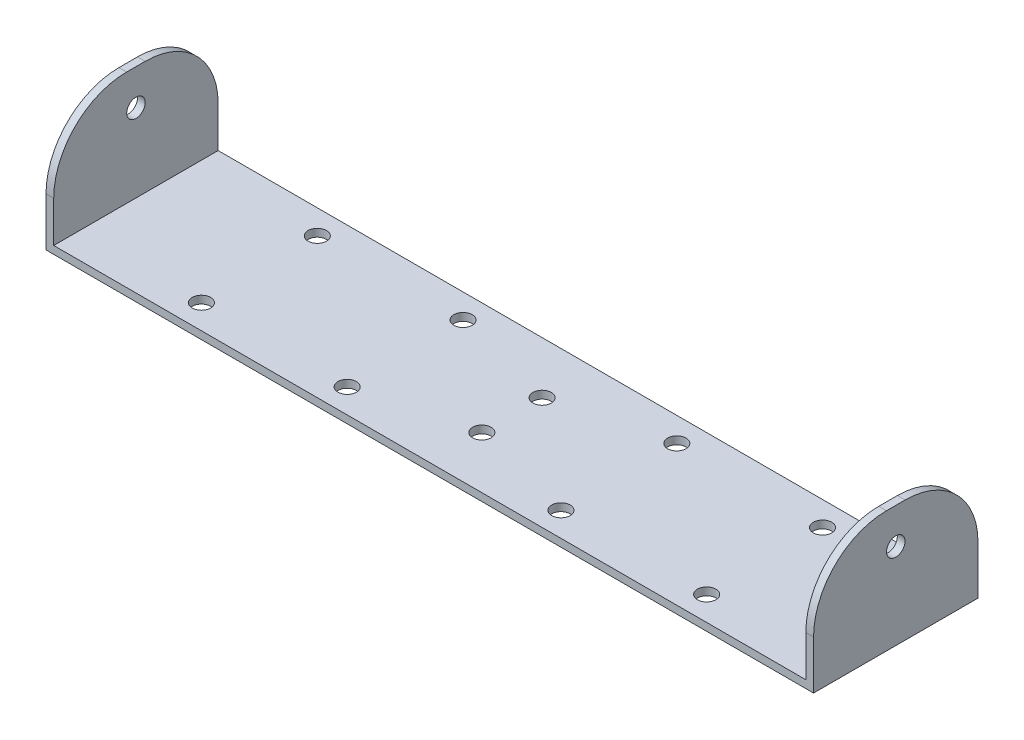
ISO-10303-21;
HEADER;
FILE_DESCRIPTION(('STEP AP214'),'2;1');
FILE_NAME('part.step','',(''),(''),'','','');
FILE_SCHEMA(('AUTOMOTIVE_DESIGN { 1 0 10303 214 1 1 1 1 }'));
ENDSEC;
DATA;
#1=APPLICATION_CONTEXT('core data for automotive mechanical design processes');
#2=APPLICATION_PROTOCOL_DEFINITION('international standard','automotive_design',2000,#1);
#3=PRODUCT_CONTEXT('',#1,'mechanical');
#4=PRODUCT('Part','Part','',(#3));
#5=PRODUCT_RELATED_PRODUCT_CATEGORY('part','',(#4));
#6=PRODUCT_DEFINITION_FORMATION('','',#4);
#7=PRODUCT_DEFINITION_CONTEXT('part definition',#1,'design');
#8=PRODUCT_DEFINITION('design','',#6,#7);
#9=PRODUCT_DEFINITION_SHAPE('','',#8);
#10=(LENGTH_UNIT() NAMED_UNIT(*) SI_UNIT(.MILLI.,.METRE.));
#11=(NAMED_UNIT(*) PLANE_ANGLE_UNIT() SI_UNIT($,.RADIAN.));
#12=(NAMED_UNIT(*) SI_UNIT($,.STERADIAN.) SOLID_ANGLE_UNIT());
#13=UNCERTAINTY_MEASURE_WITH_UNIT(LENGTH_MEASURE(1.E-05),#10,'distance_accuracy_value','');
#14=(GEOMETRIC_REPRESENTATION_CONTEXT(3) GLOBAL_UNCERTAINTY_ASSIGNED_CONTEXT((#13)) GLOBAL_UNIT_ASSIGNED_CONTEXT((#10,
#11,#12)) REPRESENTATION_CONTEXT('',''));
#15=CARTESIAN_POINT('',(0.,0.,0.));
#16=DIRECTION('',(0.,0.,1.));
#17=DIRECTION('',(1.,0.,0.));
#18=AXIS2_PLACEMENT_3D('',#15,#16,#17);
#19=CARTESIAN_POINT('',(0.,1.5875,33.85));
#20=DIRECTION('',(0.,-1.,0.));
#21=DIRECTION('',(1.,0.,0.));
#22=AXIS2_PLACEMENT_3D('',#19,#20,#21);
#23=PLANE('',#22);
#24=CARTESIAN_POINT('',(0.,1.5875,23.125));
#25=DIRECTION('',(0.,-1.,0.));
#26=DIRECTION('',(1.,0.,0.));
#27=AXIS2_PLACEMENT_3D('',#24,#25,#26);
#28=CIRCLE('',#27,1.89864999999999);
#29=CARTESIAN_POINT('',(1.89864999999999,1.5875,23.125));
#30=VERTEX_POINT('',#29);
#31=EDGE_CURVE('E387',#30,#30,#28,.T.);
#32=ORIENTED_EDGE('',*,*,#31,.T.);
#33=EDGE_LOOP('',(#32));
#34=FACE_BOUND('',#33,.T.);
#35=CARTESIAN_POINT('',(0.,1.5875,10.725));
#36=DIRECTION('',(0.,-1.,0.));
#37=DIRECTION('',(1.,0.,0.));
#38=AXIS2_PLACEMENT_3D('',#35,#36,#37);
#39=CIRCLE('',#38,1.89864999999999);
#40=CARTESIAN_POINT('',(1.89864999999999,1.5875,10.725));
#41=VERTEX_POINT('',#40);
#42=EDGE_CURVE('E391',#41,#41,#39,.T.);
#43=ORIENTED_EDGE('',*,*,#42,.T.);
#44=EDGE_LOOP('',(#43));
#45=FACE_BOUND('',#44,.T.);
#46=CARTESIAN_POINT('',(22.,1.5875,5.));
#47=DIRECTION('',(0.,-1.,0.));
#48=DIRECTION('',(1.,0.,0.));
#49=AXIS2_PLACEMENT_3D('',#46,#47,#48);
#50=CIRCLE('',#49,1.89864999999999);
#51=CARTESIAN_POINT('',(23.89865,1.5875,5.));
#52=VERTEX_POINT('',#51);
#53=EDGE_CURVE('E400',#52,#52,#50,.T.);
#54=ORIENTED_EDGE('',*,*,#53,.T.);
#55=EDGE_LOOP('',(#54));
#56=FACE_BOUND('',#55,.T.);
#57=CARTESIAN_POINT('',(52.,1.58750000000001,5.));
#58=DIRECTION('',(0.,-1.,0.));
#59=DIRECTION('',(1.,0.,0.));
#60=AXIS2_PLACEMENT_3D('',#57,#58,#59);
#61=CIRCLE('',#60,1.89864999999999);
#62=CARTESIAN_POINT('',(53.89865,1.58750000000001,5.));
#63=VERTEX_POINT('',#62);
#64=EDGE_CURVE('E406',#63,#63,#61,.T.);
#65=ORIENTED_EDGE('',*,*,#64,.T.);
#66=EDGE_LOOP('',(#65));
#67=FACE_BOUND('',#66,.T.);
#68=CARTESIAN_POINT('',(52.,1.58750000000001,28.85));
#69=DIRECTION('',(0.,-1.,0.));
#70=DIRECTION('',(1.,0.,0.));
#71=AXIS2_PLACEMENT_3D('',#68,#69,#70);
#72=CIRCLE('',#71,1.89864999999999);
#73=CARTESIAN_POINT('',(53.89865,1.58750000000001,28.85));
#74=VERTEX_POINT('',#73);
#75=EDGE_CURVE('E412',#74,#74,#72,.T.);
#76=ORIENTED_EDGE('',*,*,#75,.T.);
#77=EDGE_LOOP('',(#76));
#78=FACE_BOUND('',#77,.T.);
#79=CARTESIAN_POINT('',(22.,1.5875,28.85));
#80=DIRECTION('',(0.,-1.,0.));
#81=DIRECTION('',(1.,0.,0.));
#82=AXIS2_PLACEMENT_3D('',#79,#80,#81);
#83=CIRCLE('',#82,1.89864999999999);
#84=CARTESIAN_POINT('',(23.89865,1.5875,28.85));
#85=VERTEX_POINT('',#84);
#86=EDGE_CURVE('E418',#85,#85,#83,.T.);
#87=ORIENTED_EDGE('',*,*,#86,.T.);
#88=EDGE_LOOP('',(#87));
#89=FACE_BOUND('',#88,.T.);
#90=CARTESIAN_POINT('',(-22.,1.5875,5.));
#91=DIRECTION('',(0.,-1.,0.));
#92=DIRECTION('',(1.,0.,0.));
#93=AXIS2_PLACEMENT_3D('',#90,#91,#92);
#94=CIRCLE('',#93,1.89864999999999);
#95=CARTESIAN_POINT('',(-20.10135,1.5875,5.));
#96=VERTEX_POINT('',#95);
#97=EDGE_CURVE('E168',#96,#96,#94,.T.);
#98=ORIENTED_EDGE('',*,*,#97,.T.);
#99=EDGE_LOOP('',(#98));
#100=FACE_BOUND('',#99,.T.);
#101=CARTESIAN_POINT('',(-52.,1.58749999999999,5.));
#102=DIRECTION('',(0.,-1.,0.));
#103=DIRECTION('',(1.,0.,0.));
#104=AXIS2_PLACEMENT_3D('',#101,#102,#103);
#105=CIRCLE('',#104,1.89864999999999);
#106=CARTESIAN_POINT('',(-50.10135,1.58749999999999,5.));
#107=VERTEX_POINT('',#106);
#108=EDGE_CURVE('E180',#107,#107,#105,.T.);
#109=ORIENTED_EDGE('',*,*,#108,.T.);
#110=EDGE_LOOP('',(#109));
#111=FACE_BOUND('',#110,.T.);
#112=CARTESIAN_POINT('',(-52.,1.58749999999999,28.85));
#113=DIRECTION('',(0.,-1.,0.));
#114=DIRECTION('',(1.,0.,0.));
#115=AXIS2_PLACEMENT_3D('',#112,#113,#114);
#116=CIRCLE('',#115,1.89864999999999);
#117=CARTESIAN_POINT('',(-50.10135,1.58749999999999,28.85));
#118=VERTEX_POINT('',#117);
#119=EDGE_CURVE('E186',#118,#118,#116,.T.);
#120=ORIENTED_EDGE('',*,*,#119,.T.);
#121=EDGE_LOOP('',(#120));
#122=FACE_BOUND('',#121,.T.);
#123=CARTESIAN_POINT('',(-22.,1.5875,28.85));
#124=DIRECTION('',(0.,-1.,0.));
#125=DIRECTION('',(1.,0.,0.));
#126=AXIS2_PLACEMENT_3D('',#123,#124,#125);
#127=CIRCLE('',#126,1.89864999999999);
#128=CARTESIAN_POINT('',(-20.10135,1.5875,28.85));
#129=VERTEX_POINT('',#128);
#130=EDGE_CURVE('E192',#129,#129,#127,.T.);
#131=ORIENTED_EDGE('',*,*,#130,.T.);
#132=EDGE_LOOP('',(#131));
#133=FACE_BOUND('',#132,.T.);
#134=DIRECTION('',(-1.,0.,0.));
#135=VECTOR('',#134,1.);
#136=CARTESIAN_POINT('',(0.,1.5875,0.));
#137=LINE('',#136,#135);
#138=CARTESIAN_POINT('',(77.4125,1.58749999999999,0.));
#139=VERTEX_POINT('',#138);
#140=CARTESIAN_POINT('',(-77.4125,1.58749999999999,0.));
#141=VERTEX_POINT('',#140);
#142=EDGE_CURVE('E201',#139,#141,#137,.T.);
#143=ORIENTED_EDGE('',*,*,#142,.T.);
#144=DIRECTION('',(0.,0.,-1.));
#145=VECTOR('',#144,1.);
#146=CARTESIAN_POINT('',(-77.4125,1.58749999999999,33.85));
#147=LINE('',#146,#145);
#148=CARTESIAN_POINT('',(-77.4125,1.58749999999999,33.85));
#149=VERTEX_POINT('',#148);
#150=EDGE_CURVE('E222',#149,#141,#147,.T.);
#151=ORIENTED_EDGE('',*,*,#150,.F.);
#152=DIRECTION('',(-1.,0.,0.));
#153=VECTOR('',#152,1.);
#154=CARTESIAN_POINT('',(0.,1.5875,33.85));
#155=LINE('',#154,#153);
#156=CARTESIAN_POINT('',(77.4125,1.58749999999999,33.85));
#157=VERTEX_POINT('',#156);
#158=EDGE_CURVE('E202',#157,#149,#155,.T.);
#159=ORIENTED_EDGE('',*,*,#158,.F.);
#160=DIRECTION('',(0.,0.,-1.));
#161=VECTOR('',#160,1.);
#162=CARTESIAN_POINT('',(77.4125,1.58749999999999,33.85));
#163=LINE('',#162,#161);
#164=EDGE_CURVE('E260',#157,#139,#163,.T.);
#165=ORIENTED_EDGE('',*,*,#164,.T.);
#166=EDGE_LOOP('',(#143,#151,#159,#165));
#167=FACE_BOUND('',#166,.T.);
#168=ADVANCED_FACE('F46',(#34,#45,#56,#67,#78,#89,#100,#111,#122,#133,#167),#23,.F.);
#169=CARTESIAN_POINT('',(-77.4125,1.58749999999999,33.85));
#170=DIRECTION('',(-1.,0.,0.));
#171=DIRECTION('',(0.,0.,1.));
#172=AXIS2_PLACEMENT_3D('',#169,#170,#171);
#173=PLANE('',#172);
#174=CARTESIAN_POINT('',(-77.4125,17.6675,16.925));
#175=DIRECTION('',(-1.,0.,0.));
#176=DIRECTION('',(0.,0.,1.));
#177=AXIS2_PLACEMENT_3D('',#174,#175,#176);
#178=CIRCLE('',#177,1.89864999999998);
#179=CARTESIAN_POINT('',(-77.4125,17.6675,18.82365));
#180=VERTEX_POINT('',#179);
#181=EDGE_CURVE('E198',#180,#180,#178,.T.);
#182=ORIENTED_EDGE('',*,*,#181,.T.);
#183=EDGE_LOOP('',(#182));
#184=FACE_BOUND('',#183,.T.);
#185=DIRECTION('',(0.,0.,-1.));
#186=VECTOR('',#185,1.);
#187=CARTESIAN_POINT('',(-77.4125,25.,33.85));
#188=LINE('',#187,#186);
#189=CARTESIAN_POINT('',(-77.4125,25.,18.85));
#190=VERTEX_POINT('',#189);
#191=CARTESIAN_POINT('',(-77.4125,25.,15.));
#192=VERTEX_POINT('',#191);
#193=EDGE_CURVE('E219',#190,#192,#188,.T.);
#194=ORIENTED_EDGE('',*,*,#193,.F.);
#195=CARTESIAN_POINT('',(-77.4125,9.99999999999999,18.85));
#196=DIRECTION('',(-1.,0.,0.));
#197=DIRECTION('',(0.,0.,1.));
#198=AXIS2_PLACEMENT_3D('',#195,#196,#197);
#199=CIRCLE('',#198,15.);
#200=CARTESIAN_POINT('',(-77.4125,9.99999999999999,33.85));
#201=VERTEX_POINT('',#200);
#202=EDGE_CURVE('E238',#190,#201,#199,.F.);
#203=ORIENTED_EDGE('',*,*,#202,.T.);
#204=DIRECTION('',(0.,1.,0.));
#205=VECTOR('',#204,1.);
#206=CARTESIAN_POINT('',(-77.4125,1.58749999999999,33.85));
#207=LINE('',#206,#205);
#208=EDGE_CURVE('E204',#149,#201,#207,.T.);
#209=ORIENTED_EDGE('',*,*,#208,.F.);
#210=ORIENTED_EDGE('',*,*,#150,.T.);
#211=DIRECTION('',(0.,1.,0.));
#212=VECTOR('',#211,1.);
#213=CARTESIAN_POINT('',(-77.4125,1.58749999999999,0.));
#214=LINE('',#213,#212);
#215=CARTESIAN_POINT('',(-77.4125,9.99999999999999,0.));
#216=VERTEX_POINT('',#215);
#217=EDGE_CURVE('E209',#141,#216,#214,.T.);
#218=ORIENTED_EDGE('',*,*,#217,.T.);
#219=CARTESIAN_POINT('',(-77.4125,9.99999999999999,15.));
#220=DIRECTION('',(-1.,0.,0.));
#221=DIRECTION('',(0.,0.,1.));
#222=AXIS2_PLACEMENT_3D('',#219,#220,#221);
#223=CIRCLE('',#222,15.);
#224=EDGE_CURVE('E236',#216,#192,#223,.F.);
#225=ORIENTED_EDGE('',*,*,#224,.T.);
#226=EDGE_LOOP('',(#194,#203,#209,#210,#218,#225));
#227=FACE_BOUND('',#226,.T.);
#228=ADVANCED_FACE('F275',(#184,#227),#173,.F.);
#229=CARTESIAN_POINT('',(-79.,25.,33.85));
#230=DIRECTION('',(0.,-1.,0.));
#231=DIRECTION('',(0.,0.,-1.));
#232=AXIS2_PLACEMENT_3D('',#229,#230,#231);
#233=PLANE('',#232);
#234=DIRECTION('',(0.,0.,-1.));
#235=VECTOR('',#234,1.);
#236=CARTESIAN_POINT('',(-79.,25.,33.85));
#237=LINE('',#236,#235);
#238=CARTESIAN_POINT('',(-79.,25.,18.85));
#239=VERTEX_POINT('',#238);
#240=CARTESIAN_POINT('',(-79.,25.,15.));
#241=VERTEX_POINT('',#240);
#242=EDGE_CURVE('E216',#239,#241,#237,.T.);
#243=ORIENTED_EDGE('',*,*,#242,.F.);
#244=DIRECTION('',(-1.,0.,0.));
#245=VECTOR('',#244,1.);
#246=CARTESIAN_POINT('',(-79.,25.,18.85));
#247=LINE('',#246,#245);
#248=EDGE_CURVE('E234',#239,#190,#247,.F.);
#249=ORIENTED_EDGE('',*,*,#248,.T.);
#250=ORIENTED_EDGE('',*,*,#193,.T.);
#251=DIRECTION('',(-1.,0.,0.));
#252=VECTOR('',#251,1.);
#253=CARTESIAN_POINT('',(-79.,25.,15.));
#254=LINE('',#253,#252);
#255=EDGE_CURVE('E231',#192,#241,#254,.T.);
#256=ORIENTED_EDGE('',*,*,#255,.T.);
#257=EDGE_LOOP('',(#243,#249,#250,#256));
#258=FACE_BOUND('',#257,.T.);
#259=ADVANCED_FACE('F281',(#258),#233,.F.);
#260=CARTESIAN_POINT('',(-79.,0.,33.85));
#261=DIRECTION('',(1.,0.,0.));
#262=DIRECTION('',(0.,0.,-1.));
#263=AXIS2_PLACEMENT_3D('',#260,#261,#262);
#264=PLANE('',#263);
#265=CARTESIAN_POINT('',(-79.,17.6675,16.925));
#266=DIRECTION('',(-1.,0.,0.));
#267=DIRECTION('',(0.,0.,1.));
#268=AXIS2_PLACEMENT_3D('',#265,#266,#267);
#269=CIRCLE('',#268,1.89864999999999);
#270=CARTESIAN_POINT('',(-79.,17.6675,18.82365));
#271=VERTEX_POINT('',#270);
#272=EDGE_CURVE('E195',#271,#271,#269,.T.);
#273=ORIENTED_EDGE('',*,*,#272,.F.);
#274=EDGE_LOOP('',(#273));
#275=FACE_BOUND('',#274,.T.);
#276=DIRECTION('',(0.,-1.,0.));
#277=VECTOR('',#276,1.);
#278=CARTESIAN_POINT('',(-79.,0.,33.85));
#279=LINE('',#278,#277);
#280=CARTESIAN_POINT('',(-79.,9.99999999999999,33.85));
#281=VERTEX_POINT('',#280);
#282=CARTESIAN_POINT('',(-79.,0.,33.85));
#283=VERTEX_POINT('',#282);
#284=EDGE_CURVE('E154',#281,#283,#279,.T.);
#285=ORIENTED_EDGE('',*,*,#284,.F.);
#286=CARTESIAN_POINT('',(-79.,9.99999999999999,18.85));
#287=DIRECTION('',(1.,0.,0.));
#288=DIRECTION('',(0.,0.,-1.));
#289=AXIS2_PLACEMENT_3D('',#286,#287,#288);
#290=CIRCLE('',#289,15.);
#291=EDGE_CURVE('E229',#281,#239,#290,.F.);
#292=ORIENTED_EDGE('',*,*,#291,.T.);
#293=ORIENTED_EDGE('',*,*,#242,.T.);
#294=CARTESIAN_POINT('',(-79.,9.99999999999999,15.));
#295=DIRECTION('',(1.,0.,0.));
#296=DIRECTION('',(0.,0.,-1.));
#297=AXIS2_PLACEMENT_3D('',#294,#295,#296);
#298=CIRCLE('',#297,15.);
#299=CARTESIAN_POINT('',(-79.,9.99999999999999,0.));
#300=VERTEX_POINT('',#299);
#301=EDGE_CURVE('E227',#241,#300,#298,.F.);
#302=ORIENTED_EDGE('',*,*,#301,.T.);
#303=DIRECTION('',(0.,-1.,0.));
#304=VECTOR('',#303,1.);
#305=CARTESIAN_POINT('',(-79.,0.,0.));
#306=LINE('',#305,#304);
#307=CARTESIAN_POINT('',(-79.,0.,0.));
#308=VERTEX_POINT('',#307);
#309=EDGE_CURVE('E212',#300,#308,#306,.T.);
#310=ORIENTED_EDGE('',*,*,#309,.T.);
#311=DIRECTION('',(0.,0.,-1.));
#312=VECTOR('',#311,1.);
#313=CARTESIAN_POINT('',(-79.,0.,33.85));
#314=LINE('',#313,#312);
#315=EDGE_CURVE('E158',#283,#308,#314,.T.);
#316=ORIENTED_EDGE('',*,*,#315,.F.);
#317=EDGE_LOOP('',(#285,#292,#293,#302,#310,#316));
#318=FACE_BOUND('',#317,.T.);
#319=ADVANCED_FACE('F319',(#275,#318),#264,.F.);
#320=CARTESIAN_POINT('',(0.,0.,33.85));
#321=DIRECTION('',(0.,1.,0.));
#322=DIRECTION('',(-1.,0.,0.));
#323=AXIS2_PLACEMENT_3D('',#320,#321,#322);
#324=PLANE('',#323);
#325=CARTESIAN_POINT('',(0.,0.,23.125));
#326=DIRECTION('',(0.,-1.,0.));
#327=DIRECTION('',(0.,0.,-1.));
#328=AXIS2_PLACEMENT_3D('',#325,#326,#327);
#329=CIRCLE('',#328,1.89864999999999);
#330=CARTESIAN_POINT('',(0.,0.,21.22635));
#331=VERTEX_POINT('',#330);
#332=EDGE_CURVE('E385',#331,#331,#329,.T.);
#333=ORIENTED_EDGE('',*,*,#332,.F.);
#334=EDGE_LOOP('',(#333));
#335=FACE_BOUND('',#334,.T.);
#336=CARTESIAN_POINT('',(0.,0.,10.725));
#337=DIRECTION('',(0.,-1.,0.));
#338=DIRECTION('',(0.,0.,-1.));
#339=AXIS2_PLACEMENT_3D('',#336,#337,#338);
#340=CIRCLE('',#339,1.89864999999999);
#341=CARTESIAN_POINT('',(0.,0.,8.82635000000001));
#342=VERTEX_POINT('',#341);
#343=EDGE_CURVE('E388',#342,#342,#340,.T.);
#344=ORIENTED_EDGE('',*,*,#343,.F.);
#345=EDGE_LOOP('',(#344));
#346=FACE_BOUND('',#345,.T.);
#347=CARTESIAN_POINT('',(22.,0.,5.));
#348=DIRECTION('',(0.,-1.,0.));
#349=DIRECTION('',(0.,0.,-1.));
#350=AXIS2_PLACEMENT_3D('',#347,#348,#349);
#351=CIRCLE('',#350,1.89864999999999);
#352=CARTESIAN_POINT('',(22.,0.,3.10135000000001));
#353=VERTEX_POINT('',#352);
#354=EDGE_CURVE('E397',#353,#353,#351,.T.);
#355=ORIENTED_EDGE('',*,*,#354,.F.);
#356=EDGE_LOOP('',(#355));
#357=FACE_BOUND('',#356,.T.);
#358=CARTESIAN_POINT('',(52.,0.,5.));
#359=DIRECTION('',(0.,-1.,0.));
#360=DIRECTION('',(0.,0.,-1.));
#361=AXIS2_PLACEMENT_3D('',#358,#359,#360);
#362=CIRCLE('',#361,1.89864999999999);
#363=CARTESIAN_POINT('',(52.,0.,3.10135000000001));
#364=VERTEX_POINT('',#363);
#365=EDGE_CURVE('E403',#364,#364,#362,.T.);
#366=ORIENTED_EDGE('',*,*,#365,.F.);
#367=EDGE_LOOP('',(#366));
#368=FACE_BOUND('',#367,.T.);
#369=CARTESIAN_POINT('',(52.,0.,28.85));
#370=DIRECTION('',(0.,-1.,0.));
#371=DIRECTION('',(0.,0.,-1.));
#372=AXIS2_PLACEMENT_3D('',#369,#370,#371);
#373=CIRCLE('',#372,1.89864999999999);
#374=CARTESIAN_POINT('',(52.,0.,26.95135));
#375=VERTEX_POINT('',#374);
#376=EDGE_CURVE('E409',#375,#375,#373,.T.);
#377=ORIENTED_EDGE('',*,*,#376,.F.);
#378=EDGE_LOOP('',(#377));
#379=FACE_BOUND('',#378,.T.);
#380=CARTESIAN_POINT('',(22.,0.,28.85));
#381=DIRECTION('',(0.,-1.,0.));
#382=DIRECTION('',(0.,0.,-1.));
#383=AXIS2_PLACEMENT_3D('',#380,#381,#382);
#384=CIRCLE('',#383,1.89864999999999);
#385=CARTESIAN_POINT('',(22.,0.,26.95135));
#386=VERTEX_POINT('',#385);
#387=EDGE_CURVE('E415',#386,#386,#384,.T.);
#388=ORIENTED_EDGE('',*,*,#387,.F.);
#389=EDGE_LOOP('',(#388));
#390=FACE_BOUND('',#389,.T.);
#391=CARTESIAN_POINT('',(-22.,0.,5.));
#392=DIRECTION('',(0.,-1.,0.));
#393=DIRECTION('',(0.,0.,-1.));
#394=AXIS2_PLACEMENT_3D('',#391,#392,#393);
#395=CIRCLE('',#394,1.89864999999999);
#396=CARTESIAN_POINT('',(-22.,0.,3.10135000000001));
#397=VERTEX_POINT('',#396);
#398=EDGE_CURVE('E164',#397,#397,#395,.T.);
#399=ORIENTED_EDGE('',*,*,#398,.F.);
#400=EDGE_LOOP('',(#399));
#401=FACE_BOUND('',#400,.T.);
#402=CARTESIAN_POINT('',(-52.,0.,5.));
#403=DIRECTION('',(0.,-1.,0.));
#404=DIRECTION('',(0.,0.,-1.));
#405=AXIS2_PLACEMENT_3D('',#402,#403,#404);
#406=CIRCLE('',#405,1.89864999999999);
#407=CARTESIAN_POINT('',(-52.,0.,3.10135000000001));
#408=VERTEX_POINT('',#407);
#409=EDGE_CURVE('E177',#408,#408,#406,.T.);
#410=ORIENTED_EDGE('',*,*,#409,.F.);
#411=EDGE_LOOP('',(#410));
#412=FACE_BOUND('',#411,.T.);
#413=CARTESIAN_POINT('',(-52.,0.,28.85));
#414=DIRECTION('',(0.,-1.,0.));
#415=DIRECTION('',(0.,0.,-1.));
#416=AXIS2_PLACEMENT_3D('',#413,#414,#415);
#417=CIRCLE('',#416,1.89864999999999);
#418=CARTESIAN_POINT('',(-52.,0.,26.95135));
#419=VERTEX_POINT('',#418);
#420=EDGE_CURVE('E183',#419,#419,#417,.T.);
#421=ORIENTED_EDGE('',*,*,#420,.F.);
#422=EDGE_LOOP('',(#421));
#423=FACE_BOUND('',#422,.T.);
#424=CARTESIAN_POINT('',(-22.,0.,28.85));
#425=DIRECTION('',(0.,-1.,0.));
#426=DIRECTION('',(0.,0.,-1.));
#427=AXIS2_PLACEMENT_3D('',#424,#425,#426);
#428=CIRCLE('',#427,1.89864999999999);
#429=CARTESIAN_POINT('',(-22.,0.,26.95135));
#430=VERTEX_POINT('',#429);
#431=EDGE_CURVE('E189',#430,#430,#428,.T.);
#432=ORIENTED_EDGE('',*,*,#431,.F.);
#433=EDGE_LOOP('',(#432));
#434=FACE_BOUND('',#433,.T.);
#435=DIRECTION('',(1.,0.,0.));
#436=VECTOR('',#435,1.);
#437=CARTESIAN_POINT('',(0.,0.,0.));
#438=LINE('',#437,#436);
#439=CARTESIAN_POINT('',(79.,0.,0.));
#440=VERTEX_POINT('',#439);
#441=EDGE_CURVE('E163',#308,#440,#438,.T.);
#442=ORIENTED_EDGE('',*,*,#441,.T.);
#443=DIRECTION('',(0.,0.,-1.));
#444=VECTOR('',#443,1.);
#445=CARTESIAN_POINT('',(79.,0.,33.85));
#446=LINE('',#445,#444);
#447=CARTESIAN_POINT('',(79.,0.,33.85));
#448=VERTEX_POINT('',#447);
#449=EDGE_CURVE('E144',#448,#440,#446,.T.);
#450=ORIENTED_EDGE('',*,*,#449,.F.);
#451=DIRECTION('',(1.,0.,0.));
#452=VECTOR('',#451,1.);
#453=CARTESIAN_POINT('',(0.,0.,33.85));
#454=LINE('',#453,#452);
#455=EDGE_CURVE('E150',#283,#448,#454,.T.);
#456=ORIENTED_EDGE('',*,*,#455,.F.);
#457=ORIENTED_EDGE('',*,*,#315,.T.);
#458=EDGE_LOOP('',(#442,#450,#456,#457));
#459=FACE_BOUND('',#458,.T.);
#460=ADVANCED_FACE('F161',(#335,#346,#357,#368,#379,#390,#401,#412,#423,#434,#459),#324,.F.);
#461=CARTESIAN_POINT('',(0.,0.,33.85));
#462=DIRECTION('',(0.,0.,-1.));
#463=DIRECTION('',(-1.,0.,0.));
#464=AXIS2_PLACEMENT_3D('',#461,#462,#463);
#465=PLANE('',#464);
#466=DIRECTION('',(0.,-1.,0.));
#467=VECTOR('',#466,1.);
#468=CARTESIAN_POINT('',(79.,0.,33.85));
#469=LINE('',#468,#467);
#470=CARTESIAN_POINT('',(79.,9.99999999999999,33.85));
#471=VERTEX_POINT('',#470);
#472=EDGE_CURVE('E138',#471,#448,#469,.T.);
#473=ORIENTED_EDGE('',*,*,#472,.F.);
#474=DIRECTION('',(1.,0.,0.));
#475=VECTOR('',#474,1.);
#476=CARTESIAN_POINT('',(77.4125,9.99999999999999,33.85));
#477=LINE('',#476,#475);
#478=CARTESIAN_POINT('',(77.4125,9.99999999999999,33.85));
#479=VERTEX_POINT('',#478);
#480=EDGE_CURVE('E69',#471,#479,#477,.F.);
#481=ORIENTED_EDGE('',*,*,#480,.T.);
#482=DIRECTION('',(0.,1.,0.));
#483=VECTOR('',#482,1.);
#484=CARTESIAN_POINT('',(77.4125,1.58749999999999,33.85));
#485=LINE('',#484,#483);
#486=EDGE_CURVE('E146',#157,#479,#485,.T.);
#487=ORIENTED_EDGE('',*,*,#486,.F.);
#488=ORIENTED_EDGE('',*,*,#158,.T.);
#489=ORIENTED_EDGE('',*,*,#208,.T.);
#490=DIRECTION('',(-1.,0.,0.));
#491=VECTOR('',#490,1.);
#492=CARTESIAN_POINT('',(0.,9.99999999999999,33.85));
#493=LINE('',#492,#491);
#494=EDGE_CURVE('E225',#201,#281,#493,.T.);
#495=ORIENTED_EDGE('',*,*,#494,.T.);
#496=ORIENTED_EDGE('',*,*,#284,.T.);
#497=ORIENTED_EDGE('',*,*,#455,.T.);
#498=EDGE_LOOP('',(#473,#481,#487,#488,#489,#495,#496,#497));
#499=FACE_BOUND('',#498,.T.);
#500=ADVANCED_FACE('F151',(#499),#465,.F.);
#501=CARTESIAN_POINT('',(0.,0.,0.));
#502=DIRECTION('',(0.,0.,-1.));
#503=DIRECTION('',(-1.,0.,0.));
#504=AXIS2_PLACEMENT_3D('',#501,#502,#503);
#505=PLANE('',#504);
#506=DIRECTION('',(0.,1.,0.));
#507=VECTOR('',#506,1.);
#508=CARTESIAN_POINT('',(77.4125,1.58749999999999,0.));
#509=LINE('',#508,#507);
#510=CARTESIAN_POINT('',(77.4125,9.99999999999999,0.));
#511=VERTEX_POINT('',#510);
#512=EDGE_CURVE('E147',#139,#511,#509,.T.);
#513=ORIENTED_EDGE('',*,*,#512,.T.);
#514=DIRECTION('',(1.,0.,0.));
#515=VECTOR('',#514,1.);
#516=CARTESIAN_POINT('',(0.,9.99999999999999,0.));
#517=LINE('',#516,#515);
#518=CARTESIAN_POINT('',(79.,9.99999999999999,0.));
#519=VERTEX_POINT('',#518);
#520=EDGE_CURVE('E13',#511,#519,#517,.T.);
#521=ORIENTED_EDGE('',*,*,#520,.T.);
#522=DIRECTION('',(0.,-1.,0.));
#523=VECTOR('',#522,1.);
#524=CARTESIAN_POINT('',(79.,0.,0.));
#525=LINE('',#524,#523);
#526=EDGE_CURVE('E426',#519,#440,#525,.T.);
#527=ORIENTED_EDGE('',*,*,#526,.T.);
#528=ORIENTED_EDGE('',*,*,#441,.F.);
#529=ORIENTED_EDGE('',*,*,#309,.F.);
#530=DIRECTION('',(-1.,0.,0.));
#531=VECTOR('',#530,1.);
#532=CARTESIAN_POINT('',(-77.4125,9.99999999999999,0.));
#533=LINE('',#532,#531);
#534=EDGE_CURVE('E240',#300,#216,#533,.F.);
#535=ORIENTED_EDGE('',*,*,#534,.T.);
#536=ORIENTED_EDGE('',*,*,#217,.F.);
#537=ORIENTED_EDGE('',*,*,#142,.F.);
#538=EDGE_LOOP('',(#513,#521,#527,#528,#529,#535,#536,#537));
#539=FACE_BOUND('',#538,.T.);
#540=ADVANCED_FACE('F316',(#539),#505,.T.);
#541=CARTESIAN_POINT('',(-79.,17.6675,16.925));
#542=DIRECTION('',(-1.,0.,0.));
#543=DIRECTION('',(0.,0.,1.));
#544=AXIS2_PLACEMENT_3D('',#541,#542,#543);
#545=CYLINDRICAL_SURFACE('',#544,1.89864999999998);
#546=ORIENTED_EDGE('',*,*,#272,.T.);
#547=EDGE_LOOP('',(#546));
#548=FACE_BOUND('',#547,.T.);
#549=ORIENTED_EDGE('',*,*,#181,.F.);
#550=EDGE_LOOP('',(#549));
#551=FACE_BOUND('',#550,.T.);
#552=ADVANCED_FACE('F333',(#548,#551),#545,.F.);
#553=CARTESIAN_POINT('',(-22.,0.,28.85));
#554=DIRECTION('',(0.,-1.,0.));
#555=DIRECTION('',(0.,0.,-1.));
#556=AXIS2_PLACEMENT_3D('',#553,#554,#555);
#557=CYLINDRICAL_SURFACE('',#556,1.89864999999999);
#558=ORIENTED_EDGE('',*,*,#431,.T.);
#559=EDGE_LOOP('',(#558));
#560=FACE_BOUND('',#559,.T.);
#561=ORIENTED_EDGE('',*,*,#130,.F.);
#562=EDGE_LOOP('',(#561));
#563=FACE_BOUND('',#562,.T.);
#564=ADVANCED_FACE('F338',(#560,#563),#557,.F.);
#565=CARTESIAN_POINT('',(-52.,0.,28.85));
#566=DIRECTION('',(0.,-1.,0.));
#567=DIRECTION('',(0.,0.,-1.));
#568=AXIS2_PLACEMENT_3D('',#565,#566,#567);
#569=CYLINDRICAL_SURFACE('',#568,1.89864999999999);
#570=ORIENTED_EDGE('',*,*,#420,.T.);
#571=EDGE_LOOP('',(#570));
#572=FACE_BOUND('',#571,.T.);
#573=ORIENTED_EDGE('',*,*,#119,.F.);
#574=EDGE_LOOP('',(#573));
#575=FACE_BOUND('',#574,.T.);
#576=ADVANCED_FACE('F342',(#572,#575),#569,.F.);
#577=CARTESIAN_POINT('',(-52.,0.,5.));
#578=DIRECTION('',(0.,-1.,0.));
#579=DIRECTION('',(0.,0.,-1.));
#580=AXIS2_PLACEMENT_3D('',#577,#578,#579);
#581=CYLINDRICAL_SURFACE('',#580,1.89864999999999);
#582=ORIENTED_EDGE('',*,*,#409,.T.);
#583=EDGE_LOOP('',(#582));
#584=FACE_BOUND('',#583,.T.);
#585=ORIENTED_EDGE('',*,*,#108,.F.);
#586=EDGE_LOOP('',(#585));
#587=FACE_BOUND('',#586,.T.);
#588=ADVANCED_FACE('F346',(#584,#587),#581,.F.);
#589=CARTESIAN_POINT('',(-22.,0.,5.));
#590=DIRECTION('',(0.,-1.,0.));
#591=DIRECTION('',(0.,0.,-1.));
#592=AXIS2_PLACEMENT_3D('',#589,#590,#591);
#593=CYLINDRICAL_SURFACE('',#592,1.89864999999999);
#594=ORIENTED_EDGE('',*,*,#398,.T.);
#595=EDGE_LOOP('',(#594));
#596=FACE_BOUND('',#595,.T.);
#597=ORIENTED_EDGE('',*,*,#97,.F.);
#598=EDGE_LOOP('',(#597));
#599=FACE_BOUND('',#598,.T.);
#600=ADVANCED_FACE('F291',(#596,#599),#593,.F.);
#601=CARTESIAN_POINT('',(0.,9.99999999999999,18.85));
#602=DIRECTION('',(-1.,0.,0.));
#603=DIRECTION('',(0.,0.,1.));
#604=AXIS2_PLACEMENT_3D('',#601,#602,#603);
#605=CYLINDRICAL_SURFACE('',#604,15.);
#606=ORIENTED_EDGE('',*,*,#202,.F.);
#607=ORIENTED_EDGE('',*,*,#248,.F.);
#608=ORIENTED_EDGE('',*,*,#291,.F.);
#609=ORIENTED_EDGE('',*,*,#494,.F.);
#610=EDGE_LOOP('',(#606,#607,#608,#609));
#611=FACE_BOUND('',#610,.T.);
#612=ADVANCED_FACE('F288',(#611),#605,.T.);
#613=CARTESIAN_POINT('',(-79.,9.99999999999999,15.));
#614=DIRECTION('',(1.,0.,0.));
#615=DIRECTION('',(0.,0.,-1.));
#616=AXIS2_PLACEMENT_3D('',#613,#614,#615);
#617=CYLINDRICAL_SURFACE('',#616,15.);
#618=ORIENTED_EDGE('',*,*,#224,.F.);
#619=ORIENTED_EDGE('',*,*,#534,.F.);
#620=ORIENTED_EDGE('',*,*,#301,.F.);
#621=ORIENTED_EDGE('',*,*,#255,.F.);
#622=EDGE_LOOP('',(#618,#619,#620,#621));
#623=FACE_BOUND('',#622,.T.);
#624=ADVANCED_FACE('F290',(#623),#617,.T.);
#625=CARTESIAN_POINT('',(79.,0.,33.85));
#626=DIRECTION('',(1.,0.,0.));
#627=DIRECTION('',(0.,0.,-1.));
#628=AXIS2_PLACEMENT_3D('',#625,#626,#627);
#629=PLANE('',#628);
#630=CARTESIAN_POINT('',(79.,17.6675,16.925));
#631=DIRECTION('',(1.,0.,0.));
#632=DIRECTION('',(0.,0.,-1.));
#633=AXIS2_PLACEMENT_3D('',#630,#631,#632);
#634=CIRCLE('',#633,1.89864999999999);
#635=CARTESIAN_POINT('',(79.,17.6675,15.02635));
#636=VERTEX_POINT('',#635);
#637=EDGE_CURVE('E421',#636,#636,#634,.T.);
#638=ORIENTED_EDGE('',*,*,#637,.F.);
#639=EDGE_LOOP('',(#638));
#640=FACE_BOUND('',#639,.T.);
#641=DIRECTION('',(0.,0.,-1.));
#642=VECTOR('',#641,1.);
#643=CARTESIAN_POINT('',(79.,25.,33.85));
#644=LINE('',#643,#642);
#645=CARTESIAN_POINT('',(79.,25.,18.85));
#646=VERTEX_POINT('',#645);
#647=CARTESIAN_POINT('',(79.,25.,15.));
#648=VERTEX_POINT('',#647);
#649=EDGE_CURVE('E165',#646,#648,#644,.T.);
#650=ORIENTED_EDGE('',*,*,#649,.F.);
#651=CARTESIAN_POINT('',(79.,9.99999999999999,18.85));
#652=DIRECTION('',(1.,0.,0.));
#653=DIRECTION('',(0.,0.,-1.));
#654=AXIS2_PLACEMENT_3D('',#651,#652,#653);
#655=CIRCLE('',#654,15.);
#656=EDGE_CURVE('E145',#646,#471,#655,.T.);
#657=ORIENTED_EDGE('',*,*,#656,.T.);
#658=ORIENTED_EDGE('',*,*,#472,.T.);
#659=ORIENTED_EDGE('',*,*,#449,.T.);
#660=ORIENTED_EDGE('',*,*,#526,.F.);
#661=CARTESIAN_POINT('',(79.,9.99999999999999,15.));
#662=DIRECTION('',(1.,0.,0.));
#663=DIRECTION('',(0.,0.,-1.));
#664=AXIS2_PLACEMENT_3D('',#661,#662,#663);
#665=CIRCLE('',#664,15.);
#666=EDGE_CURVE('E247',#519,#648,#665,.T.);
#667=ORIENTED_EDGE('',*,*,#666,.T.);
#668=EDGE_LOOP('',(#650,#657,#658,#659,#660,#667));
#669=FACE_BOUND('',#668,.T.);
#670=ADVANCED_FACE('F141',(#640,#669),#629,.T.);
#671=CARTESIAN_POINT('',(79.,25.,33.85));
#672=DIRECTION('',(0.,1.,0.));
#673=DIRECTION('',(0.,0.,1.));
#674=AXIS2_PLACEMENT_3D('',#671,#672,#673);
#675=PLANE('',#674);
#676=DIRECTION('',(0.,0.,-1.));
#677=VECTOR('',#676,1.);
#678=CARTESIAN_POINT('',(77.4125,25.,33.85));
#679=LINE('',#678,#677);
#680=CARTESIAN_POINT('',(77.4125,25.,18.85));
#681=VERTEX_POINT('',#680);
#682=CARTESIAN_POINT('',(77.4125,25.,15.));
#683=VERTEX_POINT('',#682);
#684=EDGE_CURVE('E171',#681,#683,#679,.T.);
#685=ORIENTED_EDGE('',*,*,#684,.F.);
#686=DIRECTION('',(1.,0.,0.));
#687=VECTOR('',#686,1.);
#688=CARTESIAN_POINT('',(79.,25.,18.85));
#689=LINE('',#688,#687);
#690=EDGE_CURVE('E244',#681,#646,#689,.T.);
#691=ORIENTED_EDGE('',*,*,#690,.T.);
#692=ORIENTED_EDGE('',*,*,#649,.T.);
#693=DIRECTION('',(1.,0.,0.));
#694=VECTOR('',#693,1.);
#695=CARTESIAN_POINT('',(79.,25.,15.));
#696=LINE('',#695,#694);
#697=EDGE_CURVE('E242',#648,#683,#696,.F.);
#698=ORIENTED_EDGE('',*,*,#697,.T.);
#699=EDGE_LOOP('',(#685,#691,#692,#698));
#700=FACE_BOUND('',#699,.T.);
#701=ADVANCED_FACE('F258',(#700),#675,.T.);
#702=CARTESIAN_POINT('',(77.4125,1.58749999999999,33.85));
#703=DIRECTION('',(-1.,0.,0.));
#704=DIRECTION('',(0.,0.,1.));
#705=AXIS2_PLACEMENT_3D('',#702,#703,#704);
#706=PLANE('',#705);
#707=CARTESIAN_POINT('',(77.4125,17.6675,16.925));
#708=DIRECTION('',(-1.,0.,0.));
#709=DIRECTION('',(0.,0.,1.));
#710=AXIS2_PLACEMENT_3D('',#707,#708,#709);
#711=CIRCLE('',#710,1.89864999999998);
#712=CARTESIAN_POINT('',(77.4125,17.6675,18.82365));
#713=VERTEX_POINT('',#712);
#714=EDGE_CURVE('E424',#713,#713,#711,.T.);
#715=ORIENTED_EDGE('',*,*,#714,.F.);
#716=EDGE_LOOP('',(#715));
#717=FACE_BOUND('',#716,.T.);
#718=ORIENTED_EDGE('',*,*,#486,.T.);
#719=CARTESIAN_POINT('',(77.4125,9.99999999999999,18.85));
#720=DIRECTION('',(-1.,0.,0.));
#721=DIRECTION('',(0.,0.,1.));
#722=AXIS2_PLACEMENT_3D('',#719,#720,#721);
#723=CIRCLE('',#722,15.);
#724=EDGE_CURVE('E54',#479,#681,#723,.T.);
#725=ORIENTED_EDGE('',*,*,#724,.T.);
#726=ORIENTED_EDGE('',*,*,#684,.T.);
#727=CARTESIAN_POINT('',(77.4125,9.99999999999999,15.));
#728=DIRECTION('',(-1.,0.,0.));
#729=DIRECTION('',(0.,0.,1.));
#730=AXIS2_PLACEMENT_3D('',#727,#728,#729);
#731=CIRCLE('',#730,15.);
#732=EDGE_CURVE('E61',#683,#511,#731,.T.);
#733=ORIENTED_EDGE('',*,*,#732,.T.);
#734=ORIENTED_EDGE('',*,*,#512,.F.);
#735=ORIENTED_EDGE('',*,*,#164,.F.);
#736=EDGE_LOOP('',(#718,#725,#726,#733,#734,#735));
#737=FACE_BOUND('',#736,.T.);
#738=ADVANCED_FACE('F253',(#717,#737),#706,.T.);
#739=CARTESIAN_POINT('',(79.,17.6675,16.925));
#740=DIRECTION('',(1.,0.,0.));
#741=DIRECTION('',(0.,0.,-1.));
#742=AXIS2_PLACEMENT_3D('',#739,#740,#741);
#743=CYLINDRICAL_SURFACE('',#742,1.89864999999998);
#744=ORIENTED_EDGE('',*,*,#714,.T.);
#745=EDGE_LOOP('',(#744));
#746=FACE_BOUND('',#745,.T.);
#747=ORIENTED_EDGE('',*,*,#637,.T.);
#748=EDGE_LOOP('',(#747));
#749=FACE_BOUND('',#748,.T.);
#750=ADVANCED_FACE('F358',(#746,#749),#743,.F.);
#751=CARTESIAN_POINT('',(22.,0.,28.85));
#752=DIRECTION('',(0.,-1.,0.));
#753=DIRECTION('',(0.,0.,-1.));
#754=AXIS2_PLACEMENT_3D('',#751,#752,#753);
#755=CYLINDRICAL_SURFACE('',#754,1.89864999999999);
#756=ORIENTED_EDGE('',*,*,#387,.T.);
#757=EDGE_LOOP('',(#756));
#758=FACE_BOUND('',#757,.T.);
#759=ORIENTED_EDGE('',*,*,#86,.F.);
#760=EDGE_LOOP('',(#759));
#761=FACE_BOUND('',#760,.T.);
#762=ADVANCED_FACE('F362',(#758,#761),#755,.F.);
#763=CARTESIAN_POINT('',(52.,0.,28.85));
#764=DIRECTION('',(0.,-1.,0.));
#765=DIRECTION('',(0.,0.,-1.));
#766=AXIS2_PLACEMENT_3D('',#763,#764,#765);
#767=CYLINDRICAL_SURFACE('',#766,1.89864999999999);
#768=ORIENTED_EDGE('',*,*,#376,.T.);
#769=EDGE_LOOP('',(#768));
#770=FACE_BOUND('',#769,.T.);
#771=ORIENTED_EDGE('',*,*,#75,.F.);
#772=EDGE_LOOP('',(#771));
#773=FACE_BOUND('',#772,.T.);
#774=ADVANCED_FACE('F366',(#770,#773),#767,.F.);
#775=CARTESIAN_POINT('',(52.,0.,5.));
#776=DIRECTION('',(0.,-1.,0.));
#777=DIRECTION('',(0.,0.,-1.));
#778=AXIS2_PLACEMENT_3D('',#775,#776,#777);
#779=CYLINDRICAL_SURFACE('',#778,1.89864999999999);
#780=ORIENTED_EDGE('',*,*,#365,.T.);
#781=EDGE_LOOP('',(#780));
#782=FACE_BOUND('',#781,.T.);
#783=ORIENTED_EDGE('',*,*,#64,.F.);
#784=EDGE_LOOP('',(#783));
#785=FACE_BOUND('',#784,.T.);
#786=ADVANCED_FACE('F270',(#782,#785),#779,.F.);
#787=CARTESIAN_POINT('',(22.,0.,5.));
#788=DIRECTION('',(0.,-1.,0.));
#789=DIRECTION('',(0.,0.,-1.));
#790=AXIS2_PLACEMENT_3D('',#787,#788,#789);
#791=CYLINDRICAL_SURFACE('',#790,1.89864999999999);
#792=ORIENTED_EDGE('',*,*,#354,.T.);
#793=EDGE_LOOP('',(#792));
#794=FACE_BOUND('',#793,.T.);
#795=ORIENTED_EDGE('',*,*,#53,.F.);
#796=EDGE_LOOP('',(#795));
#797=FACE_BOUND('',#796,.T.);
#798=ADVANCED_FACE('F263',(#794,#797),#791,.F.);
#799=CARTESIAN_POINT('',(79.,9.99999999999999,18.85));
#800=DIRECTION('',(-1.,0.,0.));
#801=DIRECTION('',(0.,0.,1.));
#802=AXIS2_PLACEMENT_3D('',#799,#800,#801);
#803=CYLINDRICAL_SURFACE('',#802,15.);
#804=ORIENTED_EDGE('',*,*,#724,.F.);
#805=ORIENTED_EDGE('',*,*,#480,.F.);
#806=ORIENTED_EDGE('',*,*,#656,.F.);
#807=ORIENTED_EDGE('',*,*,#690,.F.);
#808=EDGE_LOOP('',(#804,#805,#806,#807));
#809=FACE_BOUND('',#808,.T.);
#810=ADVANCED_FACE('F261',(#809),#803,.T.);
#811=CARTESIAN_POINT('',(0.,9.99999999999999,15.));
#812=DIRECTION('',(1.,0.,0.));
#813=DIRECTION('',(0.,0.,-1.));
#814=AXIS2_PLACEMENT_3D('',#811,#812,#813);
#815=CYLINDRICAL_SURFACE('',#814,15.);
#816=ORIENTED_EDGE('',*,*,#732,.F.);
#817=ORIENTED_EDGE('',*,*,#697,.F.);
#818=ORIENTED_EDGE('',*,*,#666,.F.);
#819=ORIENTED_EDGE('',*,*,#520,.F.);
#820=EDGE_LOOP('',(#816,#817,#818,#819));
#821=FACE_BOUND('',#820,.T.);
#822=ADVANCED_FACE('F48',(#821),#815,.T.);
#823=CARTESIAN_POINT('',(0.,0.,10.725));
#824=DIRECTION('',(0.,-1.,0.));
#825=DIRECTION('',(0.,0.,-1.));
#826=AXIS2_PLACEMENT_3D('',#823,#824,#825);
#827=CYLINDRICAL_SURFACE('',#826,1.89864999999999);
#828=ORIENTED_EDGE('',*,*,#343,.T.);
#829=EDGE_LOOP('',(#828));
#830=FACE_BOUND('',#829,.T.);
#831=ORIENTED_EDGE('',*,*,#42,.F.);
#832=EDGE_LOOP('',(#831));
#833=FACE_BOUND('',#832,.T.);
#834=ADVANCED_FACE('F268',(#830,#833),#827,.F.);
#835=CARTESIAN_POINT('',(0.,0.,23.125));
#836=DIRECTION('',(0.,-1.,0.));
#837=DIRECTION('',(0.,0.,-1.));
#838=AXIS2_PLACEMENT_3D('',#835,#836,#837);
#839=CYLINDRICAL_SURFACE('',#838,1.89864999999999);
#840=ORIENTED_EDGE('',*,*,#332,.T.);
#841=EDGE_LOOP('',(#840));
#842=FACE_BOUND('',#841,.T.);
#843=ORIENTED_EDGE('',*,*,#31,.F.);
#844=EDGE_LOOP('',(#843));
#845=FACE_BOUND('',#844,.T.);
#846=ADVANCED_FACE('F376',(#842,#845),#839,.F.);
#847=CLOSED_SHELL('',(#168,#228,#259,#319,#460,#500,#540,#552,#564,#576,#588,#600,#612,#624,
#670,#701,#738,#750,#762,#774,#786,#798,#810,#822,#834,#846));
#848=MANIFOLD_SOLID_BREP('B2',#847);
#849=ADVANCED_BREP_SHAPE_REPRESENTATION('',(#18,#848),#14);
#850=SHAPE_DEFINITION_REPRESENTATION(#9,#849);
ENDSEC;
END-ISO-10303-21;
